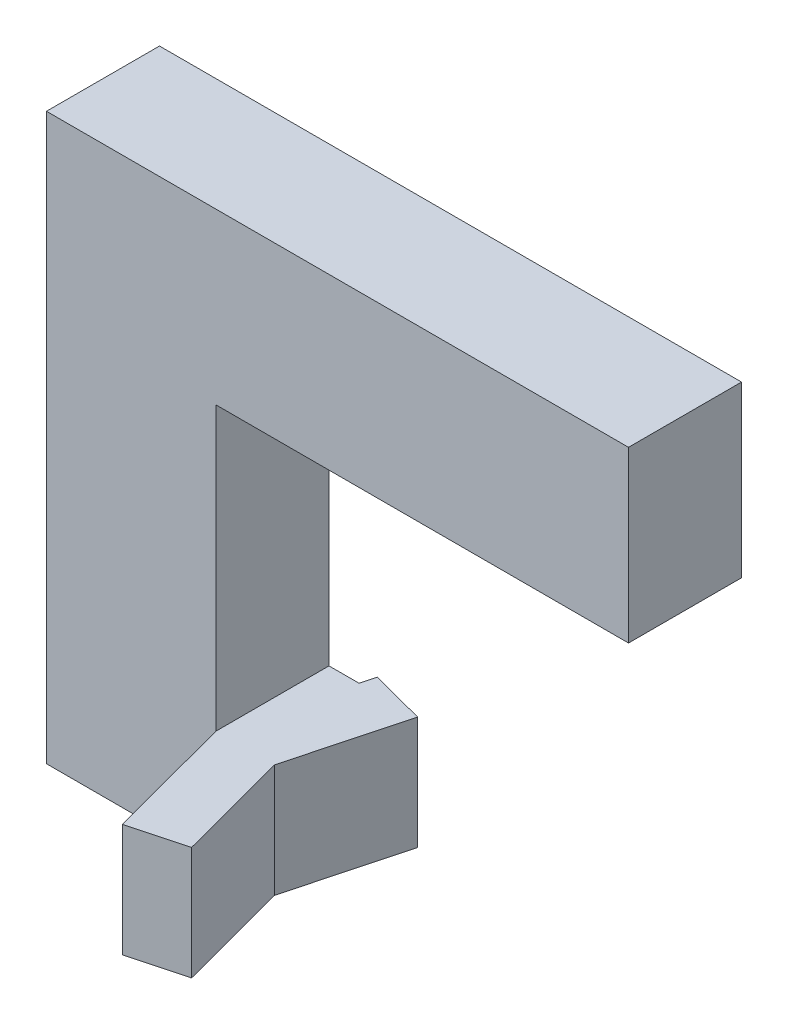
ISO-10303-21;
HEADER;
FILE_DESCRIPTION(('STEP AP214'),'2;1');
FILE_NAME('part.step','',(''),(''),'','','');
FILE_SCHEMA(('AUTOMOTIVE_DESIGN { 1 0 10303 214 1 1 1 1 }'));
ENDSEC;
DATA;
#1=APPLICATION_CONTEXT('core data for automotive mechanical design processes');
#2=APPLICATION_PROTOCOL_DEFINITION('international standard','automotive_design',2000,#1);
#3=PRODUCT_CONTEXT('',#1,'mechanical');
#4=PRODUCT('Part','Part','',(#3));
#5=PRODUCT_RELATED_PRODUCT_CATEGORY('part','',(#4));
#6=PRODUCT_DEFINITION_FORMATION('','',#4);
#7=PRODUCT_DEFINITION_CONTEXT('part definition',#1,'design');
#8=PRODUCT_DEFINITION('design','',#6,#7);
#9=PRODUCT_DEFINITION_SHAPE('','',#8);
#10=(LENGTH_UNIT() NAMED_UNIT(*) SI_UNIT(.MILLI.,.METRE.));
#11=(NAMED_UNIT(*) PLANE_ANGLE_UNIT() SI_UNIT($,.RADIAN.));
#12=(NAMED_UNIT(*) SI_UNIT($,.STERADIAN.) SOLID_ANGLE_UNIT());
#13=UNCERTAINTY_MEASURE_WITH_UNIT(LENGTH_MEASURE(1.E-05),#10,'distance_accuracy_value','');
#14=(GEOMETRIC_REPRESENTATION_CONTEXT(3) GLOBAL_UNCERTAINTY_ASSIGNED_CONTEXT((#13)) GLOBAL_UNIT_ASSIGNED_CONTEXT((#10,
#11,#12)) REPRESENTATION_CONTEXT('',''));
#15=CARTESIAN_POINT('',(0.,0.,0.));
#16=DIRECTION('',(0.,0.,1.));
#17=DIRECTION('',(1.,0.,0.));
#18=AXIS2_PLACEMENT_3D('',#15,#16,#17);
#19=CARTESIAN_POINT('',(15.,-50.,5.));
#20=DIRECTION('',(-1.,0.,0.));
#21=DIRECTION('',(0.,0.,1.));
#22=AXIS2_PLACEMENT_3D('',#19,#20,#21);
#23=PLANE('',#22);
#24=DIRECTION('',(0.,0.,1.));
#25=VECTOR('',#24,1.);
#26=CARTESIAN_POINT('',(15.,-40.,0.));
#27=LINE('',#26,#25);
#28=CARTESIAN_POINT('',(15.,-40.,-5.));
#29=VERTEX_POINT('',#28);
#30=CARTESIAN_POINT('',(15.,-40.,5.));
#31=VERTEX_POINT('',#30);
#32=EDGE_CURVE('E247',#29,#31,#27,.T.);
#33=ORIENTED_EDGE('',*,*,#32,.F.);
#34=DIRECTION('',(0.,1.,0.));
#35=VECTOR('',#34,1.);
#36=CARTESIAN_POINT('',(15.,-50.,-5.));
#37=LINE('',#36,#35);
#38=CARTESIAN_POINT('',(15.,-15.,-5.));
#39=VERTEX_POINT('',#38);
#40=EDGE_CURVE('E178',#29,#39,#37,.T.);
#41=ORIENTED_EDGE('',*,*,#40,.T.);
#42=DIRECTION('',(0.,0.,-1.));
#43=VECTOR('',#42,1.);
#44=CARTESIAN_POINT('',(15.,-15.,5.));
#45=LINE('',#44,#43);
#46=CARTESIAN_POINT('',(15.,-15.,5.));
#47=VERTEX_POINT('',#46);
#48=EDGE_CURVE('E182',#47,#39,#45,.T.);
#49=ORIENTED_EDGE('',*,*,#48,.F.);
#50=DIRECTION('',(0.,1.,0.));
#51=VECTOR('',#50,1.);
#52=CARTESIAN_POINT('',(15.,-50.,5.));
#53=LINE('',#52,#51);
#54=EDGE_CURVE('E54',#31,#47,#53,.T.);
#55=ORIENTED_EDGE('',*,*,#54,.F.);
#56=EDGE_LOOP('',(#33,#41,#49,#55));
#57=FACE_BOUND('',#56,.T.);
#58=ADVANCED_FACE('F39',(#57),#23,.F.);
#59=CARTESIAN_POINT('',(51.5,-15.,5.));
#60=DIRECTION('',(-1.,0.,0.));
#61=DIRECTION('',(0.,0.,1.));
#62=AXIS2_PLACEMENT_3D('',#59,#60,#61);
#63=PLANE('',#62);
#64=DIRECTION('',(0.,1.,0.));
#65=VECTOR('',#64,1.);
#66=CARTESIAN_POINT('',(51.5,-15.,-5.));
#67=LINE('',#66,#65);
#68=CARTESIAN_POINT('',(51.5,-15.,-5.));
#69=VERTEX_POINT('',#68);
#70=CARTESIAN_POINT('',(51.5,0.,-5.));
#71=VERTEX_POINT('',#70);
#72=EDGE_CURVE('E148',#69,#71,#67,.T.);
#73=ORIENTED_EDGE('',*,*,#72,.T.);
#74=DIRECTION('',(0.,0.,-1.));
#75=VECTOR('',#74,1.);
#76=CARTESIAN_POINT('',(51.5,0.,5.));
#77=LINE('',#76,#75);
#78=CARTESIAN_POINT('',(51.5,0.,5.));
#79=VERTEX_POINT('',#78);
#80=EDGE_CURVE('E11',#79,#71,#77,.T.);
#81=ORIENTED_EDGE('',*,*,#80,.F.);
#82=DIRECTION('',(0.,1.,0.));
#83=VECTOR('',#82,1.);
#84=CARTESIAN_POINT('',(51.5,-15.,5.));
#85=LINE('',#84,#83);
#86=CARTESIAN_POINT('',(51.5,-15.,5.));
#87=VERTEX_POINT('',#86);
#88=EDGE_CURVE('E164',#87,#79,#85,.T.);
#89=ORIENTED_EDGE('',*,*,#88,.F.);
#90=DIRECTION('',(0.,0.,-1.));
#91=VECTOR('',#90,1.);
#92=CARTESIAN_POINT('',(51.5,-15.,5.));
#93=LINE('',#92,#91);
#94=EDGE_CURVE('E169',#87,#69,#93,.T.);
#95=ORIENTED_EDGE('',*,*,#94,.T.);
#96=EDGE_LOOP('',(#73,#81,#89,#95));
#97=FACE_BOUND('',#96,.T.);
#98=ADVANCED_FACE('F41',(#97),#63,.F.);
#99=CARTESIAN_POINT('',(51.5,0.,5.));
#100=DIRECTION('',(0.,-1.,0.));
#101=DIRECTION('',(1.,0.,0.));
#102=AXIS2_PLACEMENT_3D('',#99,#100,#101);
#103=PLANE('',#102);
#104=DIRECTION('',(-1.,0.,0.));
#105=VECTOR('',#104,1.);
#106=CARTESIAN_POINT('',(51.5,0.,-5.));
#107=LINE('',#106,#105);
#108=CARTESIAN_POINT('',(0.,0.,-5.));
#109=VERTEX_POINT('',#108);
#110=EDGE_CURVE('E172',#71,#109,#107,.T.);
#111=ORIENTED_EDGE('',*,*,#110,.T.);
#112=DIRECTION('',(0.,0.,-1.));
#113=VECTOR('',#112,1.);
#114=CARTESIAN_POINT('',(0.,0.,5.));
#115=LINE('',#114,#113);
#116=CARTESIAN_POINT('',(0.,0.,5.));
#117=VERTEX_POINT('',#116);
#118=EDGE_CURVE('E47',#117,#109,#115,.T.);
#119=ORIENTED_EDGE('',*,*,#118,.F.);
#120=DIRECTION('',(-1.,0.,0.));
#121=VECTOR('',#120,1.);
#122=CARTESIAN_POINT('',(51.5,0.,5.));
#123=LINE('',#122,#121);
#124=EDGE_CURVE('E94',#79,#117,#123,.T.);
#125=ORIENTED_EDGE('',*,*,#124,.F.);
#126=ORIENTED_EDGE('',*,*,#80,.T.);
#127=EDGE_LOOP('',(#111,#119,#125,#126));
#128=FACE_BOUND('',#127,.T.);
#129=ADVANCED_FACE('F262',(#128),#103,.F.);
#130=CARTESIAN_POINT('',(0.,0.,5.));
#131=DIRECTION('',(1.,0.,0.));
#132=DIRECTION('',(0.,1.,0.));
#133=AXIS2_PLACEMENT_3D('',#130,#131,#132);
#134=PLANE('',#133);
#135=DIRECTION('',(0.,-1.,0.));
#136=VECTOR('',#135,1.);
#137=CARTESIAN_POINT('',(0.,0.,-5.));
#138=LINE('',#137,#136);
#139=CARTESIAN_POINT('',(0.,-50.,-5.));
#140=VERTEX_POINT('',#139);
#141=EDGE_CURVE('E174',#109,#140,#138,.T.);
#142=ORIENTED_EDGE('',*,*,#141,.T.);
#143=DIRECTION('',(0.,0.,-1.));
#144=VECTOR('',#143,1.);
#145=CARTESIAN_POINT('',(0.,-50.,5.));
#146=LINE('',#145,#144);
#147=CARTESIAN_POINT('',(0.,-50.,5.));
#148=VERTEX_POINT('',#147);
#149=EDGE_CURVE('E184',#148,#140,#146,.T.);
#150=ORIENTED_EDGE('',*,*,#149,.F.);
#151=DIRECTION('',(0.,-1.,0.));
#152=VECTOR('',#151,1.);
#153=CARTESIAN_POINT('',(0.,0.,5.));
#154=LINE('',#153,#152);
#155=EDGE_CURVE('E110',#117,#148,#154,.T.);
#156=ORIENTED_EDGE('',*,*,#155,.F.);
#157=ORIENTED_EDGE('',*,*,#118,.T.);
#158=EDGE_LOOP('',(#142,#150,#156,#157));
#159=FACE_BOUND('',#158,.T.);
#160=ADVANCED_FACE('F188',(#159),#134,.F.);
#161=CARTESIAN_POINT('',(0.,-50.,5.));
#162=DIRECTION('',(0.,1.,0.));
#163=DIRECTION('',(0.,0.,1.));
#164=AXIS2_PLACEMENT_3D('',#161,#162,#163);
#165=PLANE('',#164);
#166=DIRECTION('',(1.,0.,0.));
#167=VECTOR('',#166,1.);
#168=CARTESIAN_POINT('',(0.,-50.,-5.));
#169=LINE('',#168,#167);
#170=CARTESIAN_POINT('',(17.658485168768,-50.,-5.));
#171=VERTEX_POINT('',#170);
#172=EDGE_CURVE('E176',#140,#171,#169,.T.);
#173=ORIENTED_EDGE('',*,*,#172,.T.);
#174=DIRECTION('',(-0.256924383287255,0.,0.966431508836743));
#175=VECTOR('',#174,1.);
#176=CARTESIAN_POINT('',(15.2513470160732,-50.,4.05454798459645));
#177=LINE('',#176,#175);
#178=CARTESIAN_POINT('',(18.,-50.,-6.28462191643627));
#179=VERTEX_POINT('',#178);
#180=EDGE_CURVE('E133',#179,#171,#177,.T.);
#181=ORIENTED_EDGE('',*,*,#180,.F.);
#182=DIRECTION('',(-0.966431508836743,0.,-0.256924383287255));
#183=VECTOR('',#182,1.);
#184=CARTESIAN_POINT('',(2.74865298392679,-50.,-10.3391699010327));
#185=LINE('',#184,#183);
#186=CARTESIAN_POINT('',(22.8321575441837,-50.,-5.));
#187=VERTEX_POINT('',#186);
#188=EDGE_CURVE('E136',#187,#179,#185,.T.);
#189=ORIENTED_EDGE('',*,*,#188,.F.);
#190=DIRECTION('',(0.256924383287255,0.,-0.966431508836743));
#191=VECTOR('',#190,1.);
#192=CARTESIAN_POINT('',(20.0835045602569,-50.,5.33916990103273));
#193=LINE('',#192,#191);
#194=CARTESIAN_POINT('',(20.1736723754157,-50.,5.));
#195=VERTEX_POINT('',#194);
#196=EDGE_CURVE('E232',#195,#187,#193,.T.);
#197=ORIENTED_EDGE('',*,*,#196,.F.);
#198=DIRECTION('',(-0.256924383287256,0.,-0.966431508836743));
#199=VECTOR('',#198,1.);
#200=CARTESIAN_POINT('',(17.6005063662844,-50.,-4.67906851375739));
#201=LINE('',#200,#199);
#202=CARTESIAN_POINT('',(22.8321575441837,-50.,15.));
#203=VERTEX_POINT('',#202);
#204=EDGE_CURVE('E138',#203,#195,#201,.T.);
#205=ORIENTED_EDGE('',*,*,#204,.F.);
#206=DIRECTION('',(0.966431508836743,0.,-0.256924383287256));
#207=VECTOR('',#206,1.);
#208=CARTESIAN_POINT('',(5.23165117789934,-50.,19.6790685137574));
#209=LINE('',#208,#207);
#210=CARTESIAN_POINT('',(18.,-50.,16.2846219164363));
#211=VERTEX_POINT('',#210);
#212=EDGE_CURVE('E132',#211,#203,#209,.T.);
#213=ORIENTED_EDGE('',*,*,#212,.F.);
#214=DIRECTION('',(0.256924383287256,0.,0.966431508836743));
#215=VECTOR('',#214,1.);
#216=CARTESIAN_POINT('',(12.7683488221007,-50.,-3.3944465973211));
#217=LINE('',#216,#215);
#218=CARTESIAN_POINT('',(15.,-50.,5.));
#219=VERTEX_POINT('',#218);
#220=EDGE_CURVE('E122',#219,#211,#217,.T.);
#221=ORIENTED_EDGE('',*,*,#220,.F.);
#222=DIRECTION('',(1.,0.,0.));
#223=VECTOR('',#222,1.);
#224=CARTESIAN_POINT('',(0.,-50.,5.));
#225=LINE('',#224,#223);
#226=EDGE_CURVE('E104',#148,#219,#225,.T.);
#227=ORIENTED_EDGE('',*,*,#226,.F.);
#228=ORIENTED_EDGE('',*,*,#149,.T.);
#229=EDGE_LOOP('',(#173,#181,#189,#197,#205,#213,#221,#227,#228));
#230=FACE_BOUND('',#229,.T.);
#231=ADVANCED_FACE('F129',(#230),#165,.F.);
#232=CARTESIAN_POINT('',(15.,-15.,5.));
#233=DIRECTION('',(0.,1.,0.));
#234=DIRECTION('',(0.,0.,1.));
#235=AXIS2_PLACEMENT_3D('',#232,#233,#234);
#236=PLANE('',#235);
#237=DIRECTION('',(1.,0.,0.));
#238=VECTOR('',#237,1.);
#239=CARTESIAN_POINT('',(15.,-15.,-5.));
#240=LINE('',#239,#238);
#241=EDGE_CURVE('E86',#39,#69,#240,.T.);
#242=ORIENTED_EDGE('',*,*,#241,.T.);
#243=ORIENTED_EDGE('',*,*,#94,.F.);
#244=DIRECTION('',(1.,0.,0.));
#245=VECTOR('',#244,1.);
#246=CARTESIAN_POINT('',(15.,-15.,5.));
#247=LINE('',#246,#245);
#248=EDGE_CURVE('E62',#47,#87,#247,.T.);
#249=ORIENTED_EDGE('',*,*,#248,.F.);
#250=ORIENTED_EDGE('',*,*,#48,.T.);
#251=EDGE_LOOP('',(#242,#243,#249,#250));
#252=FACE_BOUND('',#251,.T.);
#253=ADVANCED_FACE('F258',(#252),#236,.F.);
#254=CARTESIAN_POINT('',(0.,0.,5.));
#255=DIRECTION('',(0.,0.,1.));
#256=DIRECTION('',(1.,0.,0.));
#257=AXIS2_PLACEMENT_3D('',#254,#255,#256);
#258=PLANE('',#257);
#259=ORIENTED_EDGE('',*,*,#88,.T.);
#260=ORIENTED_EDGE('',*,*,#124,.T.);
#261=ORIENTED_EDGE('',*,*,#155,.T.);
#262=ORIENTED_EDGE('',*,*,#226,.T.);
#263=EDGE_CURVE('E107',#219,#31,#53,.T.);
#264=ORIENTED_EDGE('',*,*,#263,.T.);
#265=ORIENTED_EDGE('',*,*,#54,.T.);
#266=ORIENTED_EDGE('',*,*,#248,.T.);
#267=EDGE_LOOP('',(#259,#260,#261,#262,#264,#265,#266));
#268=FACE_BOUND('',#267,.T.);
#269=ADVANCED_FACE('F106',(#268),#258,.T.);
#270=CARTESIAN_POINT('',(0.,0.,-5.));
#271=DIRECTION('',(0.,0.,1.));
#272=DIRECTION('',(1.,0.,0.));
#273=AXIS2_PLACEMENT_3D('',#270,#271,#272);
#274=PLANE('',#273);
#275=ORIENTED_EDGE('',*,*,#72,.F.);
#276=ORIENTED_EDGE('',*,*,#241,.F.);
#277=ORIENTED_EDGE('',*,*,#40,.F.);
#278=DIRECTION('',(1.,0.,0.));
#279=VECTOR('',#278,1.);
#280=CARTESIAN_POINT('',(0.,-40.,-5.));
#281=LINE('',#280,#279);
#282=CARTESIAN_POINT('',(17.658485168768,-40.,-5.));
#283=VERTEX_POINT('',#282);
#284=EDGE_CURVE('E245',#29,#283,#281,.T.);
#285=ORIENTED_EDGE('',*,*,#284,.T.);
#286=DIRECTION('',(0.,-1.,0.));
#287=VECTOR('',#286,1.);
#288=CARTESIAN_POINT('',(17.658485168768,-40.,-5.));
#289=LINE('',#288,#287);
#290=EDGE_CURVE('E152',#283,#171,#289,.T.);
#291=ORIENTED_EDGE('',*,*,#290,.T.);
#292=ORIENTED_EDGE('',*,*,#172,.F.);
#293=ORIENTED_EDGE('',*,*,#141,.F.);
#294=ORIENTED_EDGE('',*,*,#110,.F.);
#295=EDGE_LOOP('',(#275,#276,#277,#285,#291,#292,#293,#294));
#296=FACE_BOUND('',#295,.T.);
#297=ADVANCED_FACE('F192',(#296),#274,.F.);
#298=CARTESIAN_POINT('',(20.0835045602569,-40.,5.33916990103273));
#299=DIRECTION('',(-0.966431508836743,0.,-0.256924383287255));
#300=DIRECTION('',(-0.256924383287255,0.,0.966431508836743));
#301=AXIS2_PLACEMENT_3D('',#298,#299,#300);
#302=PLANE('',#301);
#303=ORIENTED_EDGE('',*,*,#196,.T.);
#304=DIRECTION('',(0.,-1.,0.));
#305=VECTOR('',#304,1.);
#306=CARTESIAN_POINT('',(22.8321575441837,-40.,-5.));
#307=LINE('',#306,#305);
#308=CARTESIAN_POINT('',(22.8321575441837,-40.,-5.));
#309=VERTEX_POINT('',#308);
#310=EDGE_CURVE('E145',#309,#187,#307,.T.);
#311=ORIENTED_EDGE('',*,*,#310,.F.);
#312=DIRECTION('',(0.256924383287255,0.,-0.966431508836743));
#313=VECTOR('',#312,1.);
#314=CARTESIAN_POINT('',(20.0835045602569,-40.,5.33916990103273));
#315=LINE('',#314,#313);
#316=CARTESIAN_POINT('',(20.1736723754157,-40.,5.));
#317=VERTEX_POINT('',#316);
#318=EDGE_CURVE('E144',#317,#309,#315,.T.);
#319=ORIENTED_EDGE('',*,*,#318,.F.);
#320=DIRECTION('',(0.,-1.,0.));
#321=VECTOR('',#320,1.);
#322=CARTESIAN_POINT('',(20.1736723754157,-40.,5.));
#323=LINE('',#322,#321);
#324=EDGE_CURVE('E160',#317,#195,#323,.T.);
#325=ORIENTED_EDGE('',*,*,#324,.T.);
#326=EDGE_LOOP('',(#303,#311,#319,#325));
#327=FACE_BOUND('',#326,.T.);
#328=ADVANCED_FACE('F239',(#327),#302,.F.);
#329=CARTESIAN_POINT('',(2.74865298392679,-40.,-10.3391699010327));
#330=DIRECTION('',(-0.256924383287255,0.,0.966431508836743));
#331=DIRECTION('',(0.966431508836743,0.,0.256924383287255));
#332=AXIS2_PLACEMENT_3D('',#329,#330,#331);
#333=PLANE('',#332);
#334=ORIENTED_EDGE('',*,*,#188,.T.);
#335=DIRECTION('',(0.,-1.,0.));
#336=VECTOR('',#335,1.);
#337=CARTESIAN_POINT('',(18.,-40.,-6.28462191643627));
#338=LINE('',#337,#336);
#339=CARTESIAN_POINT('',(18.,-40.,-6.28462191643627));
#340=VERTEX_POINT('',#339);
#341=EDGE_CURVE('E149',#340,#179,#338,.T.);
#342=ORIENTED_EDGE('',*,*,#341,.F.);
#343=DIRECTION('',(-0.966431508836743,0.,-0.256924383287255));
#344=VECTOR('',#343,1.);
#345=CARTESIAN_POINT('',(2.74865298392679,-40.,-10.3391699010327));
#346=LINE('',#345,#344);
#347=EDGE_CURVE('E163',#309,#340,#346,.T.);
#348=ORIENTED_EDGE('',*,*,#347,.F.);
#349=ORIENTED_EDGE('',*,*,#310,.T.);
#350=EDGE_LOOP('',(#334,#342,#348,#349));
#351=FACE_BOUND('',#350,.T.);
#352=ADVANCED_FACE('F236',(#351),#333,.F.);
#353=CARTESIAN_POINT('',(15.2513470160732,-40.,4.05454798459645));
#354=DIRECTION('',(0.966431508836743,0.,0.256924383287255));
#355=DIRECTION('',(0.256924383287255,0.,-0.966431508836743));
#356=AXIS2_PLACEMENT_3D('',#353,#354,#355);
#357=PLANE('',#356);
#358=ORIENTED_EDGE('',*,*,#180,.T.);
#359=ORIENTED_EDGE('',*,*,#290,.F.);
#360=DIRECTION('',(-0.256924383287255,0.,0.966431508836743));
#361=VECTOR('',#360,1.);
#362=CARTESIAN_POINT('',(15.2513470160732,-40.,4.05454798459645));
#363=LINE('',#362,#361);
#364=EDGE_CURVE('E243',#340,#283,#363,.T.);
#365=ORIENTED_EDGE('',*,*,#364,.F.);
#366=ORIENTED_EDGE('',*,*,#341,.T.);
#367=EDGE_LOOP('',(#358,#359,#365,#366));
#368=FACE_BOUND('',#367,.T.);
#369=ADVANCED_FACE('F257',(#368),#357,.F.);
#370=CARTESIAN_POINT('',(12.7683488221007,-40.,-3.3944465973211));
#371=DIRECTION('',(0.966431508836743,0.,-0.256924383287256));
#372=DIRECTION('',(-0.256924383287256,0.,-0.966431508836743));
#373=AXIS2_PLACEMENT_3D('',#370,#371,#372);
#374=PLANE('',#373);
#375=ORIENTED_EDGE('',*,*,#220,.T.);
#376=DIRECTION('',(0.,-1.,0.));
#377=VECTOR('',#376,1.);
#378=CARTESIAN_POINT('',(18.,-40.,16.2846219164363));
#379=LINE('',#378,#377);
#380=CARTESIAN_POINT('',(18.,-40.,16.2846219164363));
#381=VERTEX_POINT('',#380);
#382=EDGE_CURVE('E155',#381,#211,#379,.T.);
#383=ORIENTED_EDGE('',*,*,#382,.F.);
#384=DIRECTION('',(0.256924383287256,0.,0.966431508836743));
#385=VECTOR('',#384,1.);
#386=CARTESIAN_POINT('',(12.7683488221007,-40.,-3.3944465973211));
#387=LINE('',#386,#385);
#388=EDGE_CURVE('E125',#31,#381,#387,.T.);
#389=ORIENTED_EDGE('',*,*,#388,.F.);
#390=ORIENTED_EDGE('',*,*,#263,.F.);
#391=EDGE_LOOP('',(#375,#383,#389,#390));
#392=FACE_BOUND('',#391,.T.);
#393=ADVANCED_FACE('F119',(#392),#374,.F.);
#394=CARTESIAN_POINT('',(5.23165117789934,-40.,19.6790685137574));
#395=DIRECTION('',(-0.256924383287256,0.,-0.966431508836743));
#396=DIRECTION('',(-0.966431508836743,0.,0.256924383287256));
#397=AXIS2_PLACEMENT_3D('',#394,#395,#396);
#398=PLANE('',#397);
#399=ORIENTED_EDGE('',*,*,#212,.T.);
#400=DIRECTION('',(0.,-1.,0.));
#401=VECTOR('',#400,1.);
#402=CARTESIAN_POINT('',(22.8321575441837,-40.,15.));
#403=LINE('',#402,#401);
#404=CARTESIAN_POINT('',(22.8321575441837,-40.,15.));
#405=VERTEX_POINT('',#404);
#406=EDGE_CURVE('E157',#405,#203,#403,.T.);
#407=ORIENTED_EDGE('',*,*,#406,.F.);
#408=DIRECTION('',(0.966431508836743,0.,-0.256924383287256));
#409=VECTOR('',#408,1.);
#410=CARTESIAN_POINT('',(5.23165117789934,-40.,19.6790685137574));
#411=LINE('',#410,#409);
#412=EDGE_CURVE('E250',#381,#405,#411,.T.);
#413=ORIENTED_EDGE('',*,*,#412,.F.);
#414=ORIENTED_EDGE('',*,*,#382,.T.);
#415=EDGE_LOOP('',(#399,#407,#413,#414));
#416=FACE_BOUND('',#415,.T.);
#417=ADVANCED_FACE('F293',(#416),#398,.F.);
#418=CARTESIAN_POINT('',(17.6005063662844,-40.,-4.67906851375739));
#419=DIRECTION('',(-0.966431508836743,0.,0.256924383287256));
#420=DIRECTION('',(0.256924383287256,0.,0.966431508836743));
#421=AXIS2_PLACEMENT_3D('',#418,#419,#420);
#422=PLANE('',#421);
#423=ORIENTED_EDGE('',*,*,#204,.T.);
#424=ORIENTED_EDGE('',*,*,#324,.F.);
#425=DIRECTION('',(-0.256924383287256,0.,-0.966431508836743));
#426=VECTOR('',#425,1.);
#427=CARTESIAN_POINT('',(17.6005063662844,-40.,-4.67906851375739));
#428=LINE('',#427,#426);
#429=EDGE_CURVE('E228',#405,#317,#428,.T.);
#430=ORIENTED_EDGE('',*,*,#429,.F.);
#431=ORIENTED_EDGE('',*,*,#406,.T.);
#432=EDGE_LOOP('',(#423,#424,#430,#431));
#433=FACE_BOUND('',#432,.T.);
#434=ADVANCED_FACE('F290',(#433),#422,.F.);
#435=CARTESIAN_POINT('',(0.,-40.,0.));
#436=DIRECTION('',(0.,-1.,0.));
#437=DIRECTION('',(0.,0.,-1.));
#438=AXIS2_PLACEMENT_3D('',#435,#436,#437);
#439=PLANE('',#438);
#440=ORIENTED_EDGE('',*,*,#318,.T.);
#441=ORIENTED_EDGE('',*,*,#347,.T.);
#442=ORIENTED_EDGE('',*,*,#364,.T.);
#443=ORIENTED_EDGE('',*,*,#284,.F.);
#444=ORIENTED_EDGE('',*,*,#32,.T.);
#445=ORIENTED_EDGE('',*,*,#388,.T.);
#446=ORIENTED_EDGE('',*,*,#412,.T.);
#447=ORIENTED_EDGE('',*,*,#429,.T.);
#448=EDGE_LOOP('',(#440,#441,#442,#443,#444,#445,#446,#447));
#449=FACE_BOUND('',#448,.T.);
#450=ADVANCED_FACE('F253',(#449),#439,.F.);
#451=CLOSED_SHELL('',(#58,#98,#129,#160,#231,#253,#269,#297,#328,#352,#369,#393,#417,#434,#450));
#452=MANIFOLD_SOLID_BREP('B2',#451);
#453=ADVANCED_BREP_SHAPE_REPRESENTATION('',(#18,#452),#14);
#454=SHAPE_DEFINITION_REPRESENTATION(#9,#453);
ENDSEC;
END-ISO-10303-21;
